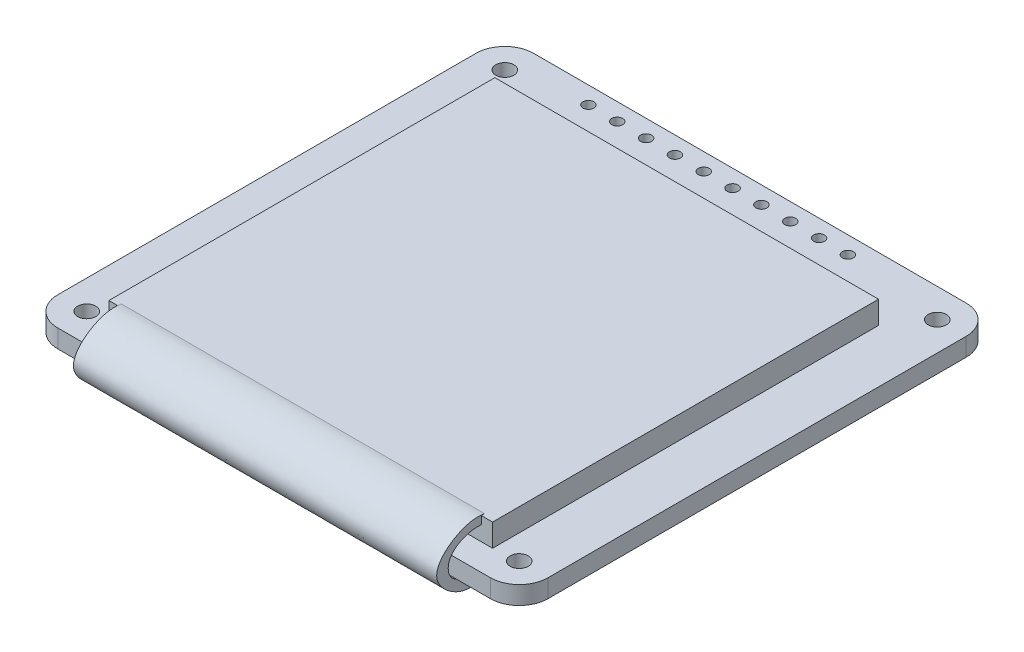
ISO-10303-21;
HEADER;
FILE_DESCRIPTION(('STEP AP214'),'2;1');
FILE_NAME('part.step','',(''),(''),'','','');
FILE_SCHEMA(('AUTOMOTIVE_DESIGN { 1 0 10303 214 1 1 1 1 }'));
ENDSEC;
DATA;
#1=APPLICATION_CONTEXT('core data for automotive mechanical design processes');
#2=APPLICATION_PROTOCOL_DEFINITION('international standard','automotive_design',2000,#1);
#3=PRODUCT_CONTEXT('',#1,'mechanical');
#4=PRODUCT('Part','Part','',(#3));
#5=PRODUCT_RELATED_PRODUCT_CATEGORY('part','',(#4));
#6=PRODUCT_DEFINITION_FORMATION('','',#4);
#7=PRODUCT_DEFINITION_CONTEXT('part definition',#1,'design');
#8=PRODUCT_DEFINITION('design','',#6,#7);
#9=PRODUCT_DEFINITION_SHAPE('','',#8);
#10=(LENGTH_UNIT() NAMED_UNIT(*) SI_UNIT(.MILLI.,.METRE.));
#11=(NAMED_UNIT(*) PLANE_ANGLE_UNIT() SI_UNIT($,.RADIAN.));
#12=(NAMED_UNIT(*) SI_UNIT($,.STERADIAN.) SOLID_ANGLE_UNIT());
#13=UNCERTAINTY_MEASURE_WITH_UNIT(LENGTH_MEASURE(1.E-05),#10,'distance_accuracy_value','');
#14=(GEOMETRIC_REPRESENTATION_CONTEXT(3) GLOBAL_UNCERTAINTY_ASSIGNED_CONTEXT((#13)) GLOBAL_UNIT_ASSIGNED_CONTEXT((#10,
#11,#12)) REPRESENTATION_CONTEXT('',''));
#15=CARTESIAN_POINT('',(0.,0.,0.));
#16=DIRECTION('',(0.,0.,1.));
#17=DIRECTION('',(1.,0.,0.));
#18=AXIS2_PLACEMENT_3D('',#15,#16,#17);
#19=CARTESIAN_POINT('',(0.,0.,0.));
#20=DIRECTION('',(0.,1.,0.));
#21=DIRECTION('',(0.,0.,1.));
#22=AXIS2_PLACEMENT_3D('',#19,#20,#21);
#23=PLANE('',#22);
#24=DIRECTION('',(-1.,0.,0.));
#25=VECTOR('',#24,1.);
#26=CARTESIAN_POINT('',(0.,0.,-41.91));
#27=LINE('',#26,#25);
#28=CARTESIAN_POINT('',(40.64,0.,-41.91));
#29=VERTEX_POINT('',#28);
#30=CARTESIAN_POINT('',(2.54,0.,-41.91));
#31=VERTEX_POINT('',#30);
#32=EDGE_CURVE('E322',#29,#31,#27,.T.);
#33=ORIENTED_EDGE('',*,*,#32,.F.);
#34=CARTESIAN_POINT('',(40.64,0.,-39.37));
#35=DIRECTION('',(0.,1.,0.));
#36=DIRECTION('',(0.,0.,1.));
#37=AXIS2_PLACEMENT_3D('',#34,#35,#36);
#38=CIRCLE('',#37,2.54);
#39=CARTESIAN_POINT('',(43.18,0.,-39.37));
#40=VERTEX_POINT('',#39);
#41=EDGE_CURVE('E224',#40,#29,#38,.T.);
#42=ORIENTED_EDGE('',*,*,#41,.F.);
#43=DIRECTION('',(0.,0.,-1.));
#44=VECTOR('',#43,1.);
#45=CARTESIAN_POINT('',(43.18,0.,0.));
#46=LINE('',#45,#44);
#47=CARTESIAN_POINT('',(43.18,0.,-2.54));
#48=VERTEX_POINT('',#47);
#49=EDGE_CURVE('E335',#48,#40,#46,.T.);
#50=ORIENTED_EDGE('',*,*,#49,.F.);
#51=CARTESIAN_POINT('',(40.64,0.,-2.54));
#52=DIRECTION('',(0.,1.,0.));
#53=DIRECTION('',(0.,0.,1.));
#54=AXIS2_PLACEMENT_3D('',#51,#52,#53);
#55=CIRCLE('',#54,2.54);
#56=CARTESIAN_POINT('',(40.64,0.,0.));
#57=VERTEX_POINT('',#56);
#58=EDGE_CURVE('E333',#57,#48,#55,.T.);
#59=ORIENTED_EDGE('',*,*,#58,.F.);
#60=DIRECTION('',(1.,0.,0.));
#61=VECTOR('',#60,1.);
#62=CARTESIAN_POINT('',(0.,0.,0.));
#63=LINE('',#62,#61);
#64=CARTESIAN_POINT('',(2.54,0.,0.));
#65=VERTEX_POINT('',#64);
#66=EDGE_CURVE('E331',#65,#57,#63,.T.);
#67=ORIENTED_EDGE('',*,*,#66,.F.);
#68=CARTESIAN_POINT('',(2.54,0.,-2.54));
#69=DIRECTION('',(0.,1.,0.));
#70=DIRECTION('',(0.,0.,1.));
#71=AXIS2_PLACEMENT_3D('',#68,#69,#70);
#72=CIRCLE('',#71,2.54);
#73=CARTESIAN_POINT('',(0.,0.,-2.54));
#74=VERTEX_POINT('',#73);
#75=EDGE_CURVE('E329',#74,#65,#72,.T.);
#76=ORIENTED_EDGE('',*,*,#75,.F.);
#77=DIRECTION('',(0.,0.,1.));
#78=VECTOR('',#77,1.);
#79=CARTESIAN_POINT('',(0.,0.,0.));
#80=LINE('',#79,#78);
#81=CARTESIAN_POINT('',(0.,0.,-39.37));
#82=VERTEX_POINT('',#81);
#83=EDGE_CURVE('E327',#82,#74,#80,.T.);
#84=ORIENTED_EDGE('',*,*,#83,.F.);
#85=CARTESIAN_POINT('',(2.54,0.,-39.37));
#86=DIRECTION('',(0.,1.,0.));
#87=DIRECTION('',(0.,0.,1.));
#88=AXIS2_PLACEMENT_3D('',#85,#86,#87);
#89=CIRCLE('',#88,2.54);
#90=EDGE_CURVE('E325',#31,#82,#89,.T.);
#91=ORIENTED_EDGE('',*,*,#90,.F.);
#92=EDGE_LOOP('',(#33,#42,#50,#59,#67,#76,#84,#91));
#93=FACE_BOUND('',#92,.T.);
#94=CARTESIAN_POINT('',(31.75,0.,-40.386));
#95=DIRECTION('',(0.,1.,0.));
#96=DIRECTION('',(0.,0.,1.));
#97=AXIS2_PLACEMENT_3D('',#94,#95,#96);
#98=CIRCLE('',#97,0.4826);
#99=CARTESIAN_POINT('',(31.75,0.,-39.9034));
#100=VERTEX_POINT('',#99);
#101=EDGE_CURVE('E319',#100,#100,#98,.T.);
#102=ORIENTED_EDGE('',*,*,#101,.T.);
#103=EDGE_LOOP('',(#102));
#104=FACE_BOUND('',#103,.T.);
#105=CARTESIAN_POINT('',(29.21,0.,-40.386));
#106=DIRECTION('',(0.,1.,0.));
#107=DIRECTION('',(0.,0.,1.));
#108=AXIS2_PLACEMENT_3D('',#105,#106,#107);
#109=CIRCLE('',#108,0.4826);
#110=CARTESIAN_POINT('',(29.21,0.,-39.9034));
#111=VERTEX_POINT('',#110);
#112=EDGE_CURVE('E316',#111,#111,#109,.T.);
#113=ORIENTED_EDGE('',*,*,#112,.T.);
#114=EDGE_LOOP('',(#113));
#115=FACE_BOUND('',#114,.T.);
#116=CARTESIAN_POINT('',(26.67,0.,-40.386));
#117=DIRECTION('',(0.,1.,0.));
#118=DIRECTION('',(0.,0.,1.));
#119=AXIS2_PLACEMENT_3D('',#116,#117,#118);
#120=CIRCLE('',#119,0.4826);
#121=CARTESIAN_POINT('',(26.67,0.,-39.9034));
#122=VERTEX_POINT('',#121);
#123=EDGE_CURVE('E313',#122,#122,#120,.T.);
#124=ORIENTED_EDGE('',*,*,#123,.T.);
#125=EDGE_LOOP('',(#124));
#126=FACE_BOUND('',#125,.T.);
#127=CARTESIAN_POINT('',(24.13,0.,-40.386));
#128=DIRECTION('',(0.,1.,0.));
#129=DIRECTION('',(0.,0.,1.));
#130=AXIS2_PLACEMENT_3D('',#127,#128,#129);
#131=CIRCLE('',#130,0.4826);
#132=CARTESIAN_POINT('',(24.13,0.,-39.9034));
#133=VERTEX_POINT('',#132);
#134=EDGE_CURVE('E310',#133,#133,#131,.T.);
#135=ORIENTED_EDGE('',*,*,#134,.T.);
#136=EDGE_LOOP('',(#135));
#137=FACE_BOUND('',#136,.T.);
#138=CARTESIAN_POINT('',(21.59,0.,-40.386));
#139=DIRECTION('',(0.,1.,0.));
#140=DIRECTION('',(0.,0.,1.));
#141=AXIS2_PLACEMENT_3D('',#138,#139,#140);
#142=CIRCLE('',#141,0.4826);
#143=CARTESIAN_POINT('',(21.59,0.,-39.9034));
#144=VERTEX_POINT('',#143);
#145=EDGE_CURVE('E307',#144,#144,#142,.T.);
#146=ORIENTED_EDGE('',*,*,#145,.T.);
#147=EDGE_LOOP('',(#146));
#148=FACE_BOUND('',#147,.T.);
#149=CARTESIAN_POINT('',(19.05,0.,-40.386));
#150=DIRECTION('',(0.,1.,0.));
#151=DIRECTION('',(0.,0.,1.));
#152=AXIS2_PLACEMENT_3D('',#149,#150,#151);
#153=CIRCLE('',#152,0.482600000000003);
#154=CARTESIAN_POINT('',(19.05,0.,-39.9034));
#155=VERTEX_POINT('',#154);
#156=EDGE_CURVE('E304',#155,#155,#153,.T.);
#157=ORIENTED_EDGE('',*,*,#156,.T.);
#158=EDGE_LOOP('',(#157));
#159=FACE_BOUND('',#158,.T.);
#160=CARTESIAN_POINT('',(16.51,0.,-40.386));
#161=DIRECTION('',(0.,1.,0.));
#162=DIRECTION('',(0.,0.,1.));
#163=AXIS2_PLACEMENT_3D('',#160,#161,#162);
#164=CIRCLE('',#163,0.482600000000003);
#165=CARTESIAN_POINT('',(16.51,0.,-39.9034));
#166=VERTEX_POINT('',#165);
#167=EDGE_CURVE('E301',#166,#166,#164,.T.);
#168=ORIENTED_EDGE('',*,*,#167,.T.);
#169=EDGE_LOOP('',(#168));
#170=FACE_BOUND('',#169,.T.);
#171=CARTESIAN_POINT('',(13.97,0.,-40.386));
#172=DIRECTION('',(0.,1.,0.));
#173=DIRECTION('',(0.,0.,1.));
#174=AXIS2_PLACEMENT_3D('',#171,#172,#173);
#175=CIRCLE('',#174,0.4826);
#176=CARTESIAN_POINT('',(13.97,0.,-39.9034));
#177=VERTEX_POINT('',#176);
#178=EDGE_CURVE('E298',#177,#177,#175,.T.);
#179=ORIENTED_EDGE('',*,*,#178,.T.);
#180=EDGE_LOOP('',(#179));
#181=FACE_BOUND('',#180,.T.);
#182=CARTESIAN_POINT('',(11.43,0.,-40.386));
#183=DIRECTION('',(0.,1.,0.));
#184=DIRECTION('',(0.,0.,1.));
#185=AXIS2_PLACEMENT_3D('',#182,#183,#184);
#186=CIRCLE('',#185,0.4826);
#187=CARTESIAN_POINT('',(11.43,0.,-39.9034));
#188=VERTEX_POINT('',#187);
#189=EDGE_CURVE('E295',#188,#188,#186,.T.);
#190=ORIENTED_EDGE('',*,*,#189,.T.);
#191=EDGE_LOOP('',(#190));
#192=FACE_BOUND('',#191,.T.);
#193=CARTESIAN_POINT('',(8.89,0.,-40.386));
#194=DIRECTION('',(0.,1.,0.));
#195=DIRECTION('',(0.,0.,1.));
#196=AXIS2_PLACEMENT_3D('',#193,#194,#195);
#197=CIRCLE('',#196,0.4826);
#198=CARTESIAN_POINT('',(8.89,0.,-39.9034));
#199=VERTEX_POINT('',#198);
#200=EDGE_CURVE('E292',#199,#199,#197,.T.);
#201=ORIENTED_EDGE('',*,*,#200,.T.);
#202=EDGE_LOOP('',(#201));
#203=FACE_BOUND('',#202,.T.);
#204=CARTESIAN_POINT('',(2.54,0.,-2.54));
#205=DIRECTION('',(0.,1.,0.));
#206=DIRECTION('',(0.,0.,1.));
#207=AXIS2_PLACEMENT_3D('',#204,#205,#206);
#208=CIRCLE('',#207,0.8);
#209=CARTESIAN_POINT('',(2.54,0.,-1.74));
#210=VERTEX_POINT('',#209);
#211=EDGE_CURVE('E289',#210,#210,#208,.T.);
#212=ORIENTED_EDGE('',*,*,#211,.T.);
#213=EDGE_LOOP('',(#212));
#214=FACE_BOUND('',#213,.T.);
#215=CARTESIAN_POINT('',(40.64,0.,-2.54));
#216=DIRECTION('',(0.,1.,0.));
#217=DIRECTION('',(0.,0.,1.));
#218=AXIS2_PLACEMENT_3D('',#215,#216,#217);
#219=CIRCLE('',#218,0.8);
#220=CARTESIAN_POINT('',(40.64,0.,-1.74));
#221=VERTEX_POINT('',#220);
#222=EDGE_CURVE('E286',#221,#221,#219,.T.);
#223=ORIENTED_EDGE('',*,*,#222,.T.);
#224=EDGE_LOOP('',(#223));
#225=FACE_BOUND('',#224,.T.);
#226=CARTESIAN_POINT('',(40.64,0.,-39.37));
#227=DIRECTION('',(0.,1.,0.));
#228=DIRECTION('',(0.,0.,1.));
#229=AXIS2_PLACEMENT_3D('',#226,#227,#228);
#230=CIRCLE('',#229,0.799999999999995);
#231=CARTESIAN_POINT('',(40.64,0.,-38.57));
#232=VERTEX_POINT('',#231);
#233=EDGE_CURVE('E283',#232,#232,#230,.T.);
#234=ORIENTED_EDGE('',*,*,#233,.T.);
#235=EDGE_LOOP('',(#234));
#236=FACE_BOUND('',#235,.T.);
#237=CARTESIAN_POINT('',(2.54,0.,-39.37));
#238=DIRECTION('',(0.,1.,0.));
#239=DIRECTION('',(0.,0.,1.));
#240=AXIS2_PLACEMENT_3D('',#237,#238,#239);
#241=CIRCLE('',#240,0.799999999999995);
#242=CARTESIAN_POINT('',(2.54,0.,-38.57));
#243=VERTEX_POINT('',#242);
#244=EDGE_CURVE('E219',#243,#243,#241,.T.);
#245=ORIENTED_EDGE('',*,*,#244,.T.);
#246=EDGE_LOOP('',(#245));
#247=FACE_BOUND('',#246,.T.);
#248=DIRECTION('',(-1.,0.,0.));
#249=VECTOR('',#248,1.);
#250=CARTESIAN_POINT('',(37.5,0.,-6.2546976987071));
#251=LINE('',#250,#249);
#252=CARTESIAN_POINT('',(5.5,-3.86409654273834E-13,-6.2546976987068));
#253=VERTEX_POINT('',#252);
#254=CARTESIAN_POINT('',(37.5,-3.86409654273834E-13,-6.2546976987068));
#255=VERTEX_POINT('',#254);
#256=EDGE_CURVE('E164',#253,#255,#251,.F.);
#257=ORIENTED_EDGE('',*,*,#256,.F.);
#258=DIRECTION('',(0.,0.,1.));
#259=VECTOR('',#258,1.);
#260=CARTESIAN_POINT('',(5.5,0.,0.));
#261=LINE('',#260,#259);
#262=CARTESIAN_POINT('',(5.5,0.,-4.65358098531131));
#263=VERTEX_POINT('',#262);
#264=EDGE_CURVE('E185',#253,#263,#261,.T.);
#265=ORIENTED_EDGE('',*,*,#264,.T.);
#266=DIRECTION('',(-1.,0.,0.));
#267=VECTOR('',#266,1.);
#268=CARTESIAN_POINT('',(37.5,0.,-4.65358098531142));
#269=LINE('',#268,#267);
#270=CARTESIAN_POINT('',(37.5,0.,-4.65358098531142));
#271=VERTEX_POINT('',#270);
#272=EDGE_CURVE('E180',#263,#271,#269,.F.);
#273=ORIENTED_EDGE('',*,*,#272,.T.);
#274=DIRECTION('',(0.,0.,1.));
#275=VECTOR('',#274,1.);
#276=CARTESIAN_POINT('',(37.5,0.,0.));
#277=LINE('',#276,#275);
#278=EDGE_CURVE('E175',#255,#271,#277,.T.);
#279=ORIENTED_EDGE('',*,*,#278,.F.);
#280=EDGE_LOOP('',(#257,#265,#273,#279));
#281=FACE_BOUND('',#280,.T.);
#282=ADVANCED_FACE('F46',(#93,#104,#115,#126,#137,#148,#159,#170,#181,#192,#203,#214,#225,#236,
#247,#281),#23,.F.);
#283=CARTESIAN_POINT('',(4.69,3.6,-2.34384451123729));
#284=DIRECTION('',(0.,0.,-1.));
#285=DIRECTION('',(-1.,0.,0.));
#286=AXIS2_PLACEMENT_3D('',#283,#284,#285);
#287=PLANE('',#286);
#288=DIRECTION('',(0.,1.,0.));
#289=VECTOR('',#288,1.);
#290=CARTESIAN_POINT('',(37.5,3.6,-2.34384451123729));
#291=LINE('',#290,#289);
#292=CARTESIAN_POINT('',(37.5,2.90662544501408,-2.34384451123717));
#293=VERTEX_POINT('',#292);
#294=CARTESIAN_POINT('',(37.5,3.6,-2.34384451123729));
#295=VERTEX_POINT('',#294);
#296=EDGE_CURVE('E181',#293,#295,#291,.T.);
#297=ORIENTED_EDGE('',*,*,#296,.F.);
#298=DIRECTION('',(-1.,0.,0.));
#299=VECTOR('',#298,1.);
#300=CARTESIAN_POINT('',(37.5,2.90662544501407,-2.34384451123729));
#301=LINE('',#300,#299);
#302=CARTESIAN_POINT('',(5.5,2.90662544501408,-2.34384451123717));
#303=VERTEX_POINT('',#302);
#304=EDGE_CURVE('E13',#293,#303,#301,.T.);
#305=ORIENTED_EDGE('',*,*,#304,.T.);
#306=DIRECTION('',(0.,1.,0.));
#307=VECTOR('',#306,1.);
#308=CARTESIAN_POINT('',(5.5,3.6,-2.34384451123729));
#309=LINE('',#308,#307);
#310=CARTESIAN_POINT('',(5.5,3.6,-2.34384451123729));
#311=VERTEX_POINT('',#310);
#312=EDGE_CURVE('E171',#303,#311,#309,.T.);
#313=ORIENTED_EDGE('',*,*,#312,.T.);
#314=DIRECTION('',(1.,0.,0.));
#315=VECTOR('',#314,1.);
#316=CARTESIAN_POINT('',(4.69,3.6,-2.34384451123729));
#317=LINE('',#316,#315);
#318=CARTESIAN_POINT('',(4.69,3.6,-2.34384451123729));
#319=VERTEX_POINT('',#318);
#320=EDGE_CURVE('E194',#319,#311,#317,.T.);
#321=ORIENTED_EDGE('',*,*,#320,.F.);
#322=DIRECTION('',(0.,-1.,0.));
#323=VECTOR('',#322,1.);
#324=CARTESIAN_POINT('',(4.69,3.6,-2.34384451123729));
#325=LINE('',#324,#323);
#326=CARTESIAN_POINT('',(4.69,1.6,-2.34384451123729));
#327=VERTEX_POINT('',#326);
#328=EDGE_CURVE('E217',#319,#327,#325,.T.);
#329=ORIENTED_EDGE('',*,*,#328,.T.);
#330=DIRECTION('',(1.,0.,0.));
#331=VECTOR('',#330,1.);
#332=CARTESIAN_POINT('',(4.69,1.6,-2.34384451123729));
#333=LINE('',#332,#331);
#334=CARTESIAN_POINT('',(38.49,1.6,-2.34384451123729));
#335=VERTEX_POINT('',#334);
#336=EDGE_CURVE('E204',#327,#335,#333,.T.);
#337=ORIENTED_EDGE('',*,*,#336,.T.);
#338=DIRECTION('',(0.,-1.,0.));
#339=VECTOR('',#338,1.);
#340=CARTESIAN_POINT('',(38.49,3.6,-2.34384451123729));
#341=LINE('',#340,#339);
#342=CARTESIAN_POINT('',(38.49,3.6,-2.34384451123729));
#343=VERTEX_POINT('',#342);
#344=EDGE_CURVE('E214',#343,#335,#341,.T.);
#345=ORIENTED_EDGE('',*,*,#344,.F.);
#346=EDGE_CURVE('E192',#295,#343,#317,.T.);
#347=ORIENTED_EDGE('',*,*,#346,.F.);
#348=EDGE_LOOP('',(#297,#305,#313,#321,#329,#337,#345,#347));
#349=FACE_BOUND('',#348,.T.);
#350=ADVANCED_FACE('F371',(#349),#287,.F.);
#351=CARTESIAN_POINT('',(0.,3.6,0.));
#352=DIRECTION('',(0.,1.,0.));
#353=DIRECTION('',(0.,0.,1.));
#354=AXIS2_PLACEMENT_3D('',#351,#352,#353);
#355=PLANE('',#354);
#356=DIRECTION('',(-1.,0.,0.));
#357=VECTOR('',#356,1.);
#358=CARTESIAN_POINT('',(37.5,3.6,-2.63646709110652));
#359=LINE('',#358,#357);
#360=CARTESIAN_POINT('',(5.5,3.6,-2.63646709110653));
#361=VERTEX_POINT('',#360);
#362=CARTESIAN_POINT('',(37.5,3.6,-2.63646709110652));
#363=VERTEX_POINT('',#362);
#364=EDGE_CURVE('E361',#361,#363,#359,.F.);
#365=ORIENTED_EDGE('',*,*,#364,.T.);
#366=DIRECTION('',(0.,0.,1.));
#367=VECTOR('',#366,1.);
#368=CARTESIAN_POINT('',(37.5,3.6,0.));
#369=LINE('',#368,#367);
#370=EDGE_CURVE('E54',#363,#295,#369,.T.);
#371=ORIENTED_EDGE('',*,*,#370,.T.);
#372=ORIENTED_EDGE('',*,*,#346,.T.);
#373=DIRECTION('',(0.,0.,-1.));
#374=VECTOR('',#373,1.);
#375=CARTESIAN_POINT('',(38.49,3.6,-36.3438445112373));
#376=LINE('',#375,#374);
#377=CARTESIAN_POINT('',(38.49,3.6,-36.3438445112373));
#378=VERTEX_POINT('',#377);
#379=EDGE_CURVE('E197',#343,#378,#376,.T.);
#380=ORIENTED_EDGE('',*,*,#379,.T.);
#381=DIRECTION('',(-1.,0.,0.));
#382=VECTOR('',#381,1.);
#383=CARTESIAN_POINT('',(4.69,3.6,-36.3438445112373));
#384=LINE('',#383,#382);
#385=CARTESIAN_POINT('',(4.69,3.6,-36.3438445112373));
#386=VERTEX_POINT('',#385);
#387=EDGE_CURVE('E199',#378,#386,#384,.T.);
#388=ORIENTED_EDGE('',*,*,#387,.T.);
#389=DIRECTION('',(0.,0.,1.));
#390=VECTOR('',#389,1.);
#391=CARTESIAN_POINT('',(4.69,3.6,-36.3438445112373));
#392=LINE('',#391,#390);
#393=EDGE_CURVE('E189',#386,#319,#392,.T.);
#394=ORIENTED_EDGE('',*,*,#393,.T.);
#395=ORIENTED_EDGE('',*,*,#320,.T.);
#396=DIRECTION('',(0.,0.,1.));
#397=VECTOR('',#396,1.);
#398=CARTESIAN_POINT('',(5.5,3.6,0.));
#399=LINE('',#398,#397);
#400=EDGE_CURVE('E363',#361,#311,#399,.T.);
#401=ORIENTED_EDGE('',*,*,#400,.F.);
#402=EDGE_LOOP('',(#365,#371,#372,#380,#388,#394,#395,#401));
#403=FACE_BOUND('',#402,.T.);
#404=ADVANCED_FACE('F366',(#403),#355,.T.);
#405=CARTESIAN_POINT('',(0.,1.6,0.));
#406=DIRECTION('',(0.,1.,0.));
#407=DIRECTION('',(0.,0.,1.));
#408=AXIS2_PLACEMENT_3D('',#405,#406,#407);
#409=PLANE('',#408);
#410=CARTESIAN_POINT('',(2.54,1.6,-39.37));
#411=DIRECTION('',(0.,1.,0.));
#412=DIRECTION('',(0.,0.,1.));
#413=AXIS2_PLACEMENT_3D('',#410,#411,#412);
#414=CIRCLE('',#413,0.799999999999995);
#415=CARTESIAN_POINT('',(2.54,1.6,-38.57));
#416=VERTEX_POINT('',#415);
#417=EDGE_CURVE('E220',#416,#416,#414,.T.);
#418=ORIENTED_EDGE('',*,*,#417,.F.);
#419=EDGE_LOOP('',(#418));
#420=FACE_BOUND('',#419,.T.);
#421=CARTESIAN_POINT('',(40.64,1.6,-39.37));
#422=DIRECTION('',(0.,1.,0.));
#423=DIRECTION('',(0.,0.,1.));
#424=AXIS2_PLACEMENT_3D('',#421,#422,#423);
#425=CIRCLE('',#424,0.799999999999995);
#426=CARTESIAN_POINT('',(40.64,1.6,-38.57));
#427=VERTEX_POINT('',#426);
#428=EDGE_CURVE('E223',#427,#427,#425,.T.);
#429=ORIENTED_EDGE('',*,*,#428,.F.);
#430=EDGE_LOOP('',(#429));
#431=FACE_BOUND('',#430,.T.);
#432=CARTESIAN_POINT('',(40.64,1.6,-2.54));
#433=DIRECTION('',(0.,1.,0.));
#434=DIRECTION('',(0.,0.,1.));
#435=AXIS2_PLACEMENT_3D('',#432,#433,#434);
#436=CIRCLE('',#435,0.8);
#437=CARTESIAN_POINT('',(40.64,1.6,-1.74));
#438=VERTEX_POINT('',#437);
#439=EDGE_CURVE('E227',#438,#438,#436,.T.);
#440=ORIENTED_EDGE('',*,*,#439,.F.);
#441=EDGE_LOOP('',(#440));
#442=FACE_BOUND('',#441,.T.);
#443=CARTESIAN_POINT('',(2.54,1.6,-2.54));
#444=DIRECTION('',(0.,1.,0.));
#445=DIRECTION('',(0.,0.,1.));
#446=AXIS2_PLACEMENT_3D('',#443,#444,#445);
#447=CIRCLE('',#446,0.8);
#448=CARTESIAN_POINT('',(2.54,1.6,-1.74));
#449=VERTEX_POINT('',#448);
#450=EDGE_CURVE('E230',#449,#449,#447,.T.);
#451=ORIENTED_EDGE('',*,*,#450,.F.);
#452=EDGE_LOOP('',(#451));
#453=FACE_BOUND('',#452,.T.);
#454=CARTESIAN_POINT('',(8.89,1.6,-40.386));
#455=DIRECTION('',(0.,1.,0.));
#456=DIRECTION('',(0.,0.,1.));
#457=AXIS2_PLACEMENT_3D('',#454,#455,#456);
#458=CIRCLE('',#457,0.4826);
#459=CARTESIAN_POINT('',(8.89,1.6,-39.9034));
#460=VERTEX_POINT('',#459);
#461=EDGE_CURVE('E233',#460,#460,#458,.T.);
#462=ORIENTED_EDGE('',*,*,#461,.F.);
#463=EDGE_LOOP('',(#462));
#464=FACE_BOUND('',#463,.T.);
#465=CARTESIAN_POINT('',(11.43,1.6,-40.386));
#466=DIRECTION('',(0.,1.,0.));
#467=DIRECTION('',(0.,0.,1.));
#468=AXIS2_PLACEMENT_3D('',#465,#466,#467);
#469=CIRCLE('',#468,0.4826);
#470=CARTESIAN_POINT('',(11.43,1.6,-39.9034));
#471=VERTEX_POINT('',#470);
#472=EDGE_CURVE('E236',#471,#471,#469,.T.);
#473=ORIENTED_EDGE('',*,*,#472,.F.);
#474=EDGE_LOOP('',(#473));
#475=FACE_BOUND('',#474,.T.);
#476=CARTESIAN_POINT('',(13.97,1.6,-40.386));
#477=DIRECTION('',(0.,1.,0.));
#478=DIRECTION('',(0.,0.,1.));
#479=AXIS2_PLACEMENT_3D('',#476,#477,#478);
#480=CIRCLE('',#479,0.4826);
#481=CARTESIAN_POINT('',(13.97,1.6,-39.9034));
#482=VERTEX_POINT('',#481);
#483=EDGE_CURVE('E239',#482,#482,#480,.T.);
#484=ORIENTED_EDGE('',*,*,#483,.F.);
#485=EDGE_LOOP('',(#484));
#486=FACE_BOUND('',#485,.T.);
#487=CARTESIAN_POINT('',(16.51,1.6,-40.386));
#488=DIRECTION('',(0.,1.,0.));
#489=DIRECTION('',(0.,0.,1.));
#490=AXIS2_PLACEMENT_3D('',#487,#488,#489);
#491=CIRCLE('',#490,0.482600000000003);
#492=CARTESIAN_POINT('',(16.51,1.6,-39.9034));
#493=VERTEX_POINT('',#492);
#494=EDGE_CURVE('E242',#493,#493,#491,.T.);
#495=ORIENTED_EDGE('',*,*,#494,.F.);
#496=EDGE_LOOP('',(#495));
#497=FACE_BOUND('',#496,.T.);
#498=CARTESIAN_POINT('',(19.05,1.6,-40.386));
#499=DIRECTION('',(0.,1.,0.));
#500=DIRECTION('',(0.,0.,1.));
#501=AXIS2_PLACEMENT_3D('',#498,#499,#500);
#502=CIRCLE('',#501,0.482600000000003);
#503=CARTESIAN_POINT('',(19.05,1.6,-39.9034));
#504=VERTEX_POINT('',#503);
#505=EDGE_CURVE('E245',#504,#504,#502,.T.);
#506=ORIENTED_EDGE('',*,*,#505,.F.);
#507=EDGE_LOOP('',(#506));
#508=FACE_BOUND('',#507,.T.);
#509=CARTESIAN_POINT('',(21.59,1.6,-40.386));
#510=DIRECTION('',(0.,1.,0.));
#511=DIRECTION('',(0.,0.,1.));
#512=AXIS2_PLACEMENT_3D('',#509,#510,#511);
#513=CIRCLE('',#512,0.4826);
#514=CARTESIAN_POINT('',(21.59,1.6,-39.9034));
#515=VERTEX_POINT('',#514);
#516=EDGE_CURVE('E248',#515,#515,#513,.T.);
#517=ORIENTED_EDGE('',*,*,#516,.F.);
#518=EDGE_LOOP('',(#517));
#519=FACE_BOUND('',#518,.T.);
#520=CARTESIAN_POINT('',(24.13,1.6,-40.386));
#521=DIRECTION('',(0.,1.,0.));
#522=DIRECTION('',(0.,0.,1.));
#523=AXIS2_PLACEMENT_3D('',#520,#521,#522);
#524=CIRCLE('',#523,0.4826);
#525=CARTESIAN_POINT('',(24.13,1.6,-39.9034));
#526=VERTEX_POINT('',#525);
#527=EDGE_CURVE('E251',#526,#526,#524,.T.);
#528=ORIENTED_EDGE('',*,*,#527,.F.);
#529=EDGE_LOOP('',(#528));
#530=FACE_BOUND('',#529,.T.);
#531=CARTESIAN_POINT('',(26.67,1.6,-40.386));
#532=DIRECTION('',(0.,1.,0.));
#533=DIRECTION('',(0.,0.,1.));
#534=AXIS2_PLACEMENT_3D('',#531,#532,#533);
#535=CIRCLE('',#534,0.4826);
#536=CARTESIAN_POINT('',(26.67,1.6,-39.9034));
#537=VERTEX_POINT('',#536);
#538=EDGE_CURVE('E254',#537,#537,#535,.T.);
#539=ORIENTED_EDGE('',*,*,#538,.F.);
#540=EDGE_LOOP('',(#539));
#541=FACE_BOUND('',#540,.T.);
#542=CARTESIAN_POINT('',(29.21,1.6,-40.386));
#543=DIRECTION('',(0.,1.,0.));
#544=DIRECTION('',(0.,0.,1.));
#545=AXIS2_PLACEMENT_3D('',#542,#543,#544);
#546=CIRCLE('',#545,0.4826);
#547=CARTESIAN_POINT('',(29.21,1.6,-39.9034));
#548=VERTEX_POINT('',#547);
#549=EDGE_CURVE('E257',#548,#548,#546,.T.);
#550=ORIENTED_EDGE('',*,*,#549,.F.);
#551=EDGE_LOOP('',(#550));
#552=FACE_BOUND('',#551,.T.);
#553=CARTESIAN_POINT('',(31.75,1.6,-40.386));
#554=DIRECTION('',(0.,1.,0.));
#555=DIRECTION('',(0.,0.,1.));
#556=AXIS2_PLACEMENT_3D('',#553,#554,#555);
#557=CIRCLE('',#556,0.4826);
#558=CARTESIAN_POINT('',(31.75,1.6,-39.9034));
#559=VERTEX_POINT('',#558);
#560=EDGE_CURVE('E260',#559,#559,#557,.T.);
#561=ORIENTED_EDGE('',*,*,#560,.F.);
#562=EDGE_LOOP('',(#561));
#563=FACE_BOUND('',#562,.T.);
#564=DIRECTION('',(-1.,0.,0.));
#565=VECTOR('',#564,1.);
#566=CARTESIAN_POINT('',(0.,1.6,-41.91));
#567=LINE('',#566,#565);
#568=CARTESIAN_POINT('',(40.64,1.6,-41.91));
#569=VERTEX_POINT('',#568);
#570=CARTESIAN_POINT('',(2.54,1.6,-41.91));
#571=VERTEX_POINT('',#570);
#572=EDGE_CURVE('E263',#569,#571,#567,.T.);
#573=ORIENTED_EDGE('',*,*,#572,.T.);
#574=CARTESIAN_POINT('',(2.54,1.6,-39.37));
#575=DIRECTION('',(0.,1.,0.));
#576=DIRECTION('',(0.,0.,1.));
#577=AXIS2_PLACEMENT_3D('',#574,#575,#576);
#578=CIRCLE('',#577,2.54);
#579=CARTESIAN_POINT('',(0.,1.6,-39.37));
#580=VERTEX_POINT('',#579);
#581=EDGE_CURVE('E266',#571,#580,#578,.T.);
#582=ORIENTED_EDGE('',*,*,#581,.T.);
#583=DIRECTION('',(0.,0.,1.));
#584=VECTOR('',#583,1.);
#585=CARTESIAN_POINT('',(0.,1.6,0.));
#586=LINE('',#585,#584);
#587=CARTESIAN_POINT('',(0.,1.6,-2.54));
#588=VERTEX_POINT('',#587);
#589=EDGE_CURVE('E268',#580,#588,#586,.T.);
#590=ORIENTED_EDGE('',*,*,#589,.T.);
#591=CARTESIAN_POINT('',(2.54,1.6,-2.54));
#592=DIRECTION('',(0.,1.,0.));
#593=DIRECTION('',(0.,0.,1.));
#594=AXIS2_PLACEMENT_3D('',#591,#592,#593);
#595=CIRCLE('',#594,2.54);
#596=CARTESIAN_POINT('',(2.54,1.6,0.));
#597=VERTEX_POINT('',#596);
#598=EDGE_CURVE('E270',#588,#597,#595,.T.);
#599=ORIENTED_EDGE('',*,*,#598,.T.);
#600=DIRECTION('',(1.,0.,0.));
#601=VECTOR('',#600,1.);
#602=CARTESIAN_POINT('',(0.,1.6,0.));
#603=LINE('',#602,#601);
#604=CARTESIAN_POINT('',(40.64,1.6,0.));
#605=VERTEX_POINT('',#604);
#606=EDGE_CURVE('E272',#597,#605,#603,.T.);
#607=ORIENTED_EDGE('',*,*,#606,.T.);
#608=CARTESIAN_POINT('',(40.64,1.6,-2.54));
#609=DIRECTION('',(0.,1.,0.));
#610=DIRECTION('',(0.,0.,1.));
#611=AXIS2_PLACEMENT_3D('',#608,#609,#610);
#612=CIRCLE('',#611,2.54);
#613=CARTESIAN_POINT('',(43.18,1.6,-2.54));
#614=VERTEX_POINT('',#613);
#615=EDGE_CURVE('E274',#605,#614,#612,.T.);
#616=ORIENTED_EDGE('',*,*,#615,.T.);
#617=DIRECTION('',(0.,0.,-1.));
#618=VECTOR('',#617,1.);
#619=CARTESIAN_POINT('',(43.18,1.6,0.));
#620=LINE('',#619,#618);
#621=CARTESIAN_POINT('',(43.18,1.6,-39.37));
#622=VERTEX_POINT('',#621);
#623=EDGE_CURVE('E276',#614,#622,#620,.T.);
#624=ORIENTED_EDGE('',*,*,#623,.T.);
#625=CARTESIAN_POINT('',(40.64,1.6,-39.37));
#626=DIRECTION('',(0.,1.,0.));
#627=DIRECTION('',(0.,0.,1.));
#628=AXIS2_PLACEMENT_3D('',#625,#626,#627);
#629=CIRCLE('',#628,2.54);
#630=EDGE_CURVE('E278',#622,#569,#629,.T.);
#631=ORIENTED_EDGE('',*,*,#630,.T.);
#632=EDGE_LOOP('',(#573,#582,#590,#599,#607,#616,#624,#631));
#633=FACE_BOUND('',#632,.T.);
#634=ORIENTED_EDGE('',*,*,#336,.F.);
#635=DIRECTION('',(0.,0.,1.));
#636=VECTOR('',#635,1.);
#637=CARTESIAN_POINT('',(4.69,1.6,-36.3438445112373));
#638=LINE('',#637,#636);
#639=CARTESIAN_POINT('',(4.69,1.6,-36.3438445112373));
#640=VERTEX_POINT('',#639);
#641=EDGE_CURVE('E183',#640,#327,#638,.T.);
#642=ORIENTED_EDGE('',*,*,#641,.F.);
#643=DIRECTION('',(-1.,0.,0.));
#644=VECTOR('',#643,1.);
#645=CARTESIAN_POINT('',(4.69,1.6,-36.3438445112373));
#646=LINE('',#645,#644);
#647=CARTESIAN_POINT('',(38.49,1.6,-36.3438445112373));
#648=VERTEX_POINT('',#647);
#649=EDGE_CURVE('E193',#648,#640,#646,.T.);
#650=ORIENTED_EDGE('',*,*,#649,.F.);
#651=DIRECTION('',(0.,0.,-1.));
#652=VECTOR('',#651,1.);
#653=CARTESIAN_POINT('',(38.49,1.6,-36.3438445112373));
#654=LINE('',#653,#652);
#655=EDGE_CURVE('E206',#335,#648,#654,.T.);
#656=ORIENTED_EDGE('',*,*,#655,.F.);
#657=EDGE_LOOP('',(#634,#642,#650,#656));
#658=FACE_BOUND('',#657,.T.);
#659=ADVANCED_FACE('F418',(#420,#431,#442,#453,#464,#475,#486,#497,#508,#519,#530,#541,#552,
#563,#633,#658),#409,.T.);
#660=CARTESIAN_POINT('',(0.,1.6,-41.91));
#661=DIRECTION('',(0.,0.,1.));
#662=DIRECTION('',(1.,0.,0.));
#663=AXIS2_PLACEMENT_3D('',#660,#661,#662);
#664=PLANE('',#663);
#665=ORIENTED_EDGE('',*,*,#32,.T.);
#666=DIRECTION('',(0.,-1.,0.));
#667=VECTOR('',#666,1.);
#668=CARTESIAN_POINT('',(2.54,1.6,-41.91));
#669=LINE('',#668,#667);
#670=EDGE_CURVE('E358',#571,#31,#669,.T.);
#671=ORIENTED_EDGE('',*,*,#670,.F.);
#672=ORIENTED_EDGE('',*,*,#572,.F.);
#673=DIRECTION('',(0.,-1.,0.));
#674=VECTOR('',#673,1.);
#675=CARTESIAN_POINT('',(40.64,1.6,-41.91));
#676=LINE('',#675,#674);
#677=EDGE_CURVE('E280',#569,#29,#676,.T.);
#678=ORIENTED_EDGE('',*,*,#677,.T.);
#679=EDGE_LOOP('',(#665,#671,#672,#678));
#680=FACE_BOUND('',#679,.T.);
#681=ADVANCED_FACE('F431',(#680),#664,.F.);
#682=CARTESIAN_POINT('',(2.54,1.6,-39.37));
#683=DIRECTION('',(0.,-1.,0.));
#684=DIRECTION('',(0.,0.,-1.));
#685=AXIS2_PLACEMENT_3D('',#682,#683,#684);
#686=CYLINDRICAL_SURFACE('',#685,2.54);
#687=ORIENTED_EDGE('',*,*,#90,.T.);
#688=DIRECTION('',(0.,-1.,0.));
#689=VECTOR('',#688,1.);
#690=CARTESIAN_POINT('',(0.,1.6,-39.37));
#691=LINE('',#690,#689);
#692=EDGE_CURVE('E355',#580,#82,#691,.T.);
#693=ORIENTED_EDGE('',*,*,#692,.F.);
#694=ORIENTED_EDGE('',*,*,#581,.F.);
#695=ORIENTED_EDGE('',*,*,#670,.T.);
#696=EDGE_LOOP('',(#687,#693,#694,#695));
#697=FACE_BOUND('',#696,.T.);
#698=ADVANCED_FACE('F459',(#697),#686,.T.);
#699=CARTESIAN_POINT('',(0.,1.6,0.));
#700=DIRECTION('',(1.,0.,0.));
#701=DIRECTION('',(0.,0.,-1.));
#702=AXIS2_PLACEMENT_3D('',#699,#700,#701);
#703=PLANE('',#702);
#704=ORIENTED_EDGE('',*,*,#83,.T.);
#705=DIRECTION('',(0.,-1.,0.));
#706=VECTOR('',#705,1.);
#707=CARTESIAN_POINT('',(0.,1.6,-2.54));
#708=LINE('',#707,#706);
#709=EDGE_CURVE('E352',#588,#74,#708,.T.);
#710=ORIENTED_EDGE('',*,*,#709,.F.);
#711=ORIENTED_EDGE('',*,*,#589,.F.);
#712=ORIENTED_EDGE('',*,*,#692,.T.);
#713=EDGE_LOOP('',(#704,#710,#711,#712));
#714=FACE_BOUND('',#713,.T.);
#715=ADVANCED_FACE('F455',(#714),#703,.F.);
#716=CARTESIAN_POINT('',(2.54,1.6,-2.54));
#717=DIRECTION('',(0.,-1.,0.));
#718=DIRECTION('',(0.,0.,-1.));
#719=AXIS2_PLACEMENT_3D('',#716,#717,#718);
#720=CYLINDRICAL_SURFACE('',#719,2.54);
#721=ORIENTED_EDGE('',*,*,#75,.T.);
#722=DIRECTION('',(0.,-1.,0.));
#723=VECTOR('',#722,1.);
#724=CARTESIAN_POINT('',(2.54,1.6,0.));
#725=LINE('',#724,#723);
#726=EDGE_CURVE('E349',#597,#65,#725,.T.);
#727=ORIENTED_EDGE('',*,*,#726,.F.);
#728=ORIENTED_EDGE('',*,*,#598,.F.);
#729=ORIENTED_EDGE('',*,*,#709,.T.);
#730=EDGE_LOOP('',(#721,#727,#728,#729));
#731=FACE_BOUND('',#730,.T.);
#732=ADVANCED_FACE('F451',(#731),#720,.T.);
#733=CARTESIAN_POINT('',(0.,1.6,0.));
#734=DIRECTION('',(0.,0.,-1.));
#735=DIRECTION('',(-1.,0.,0.));
#736=AXIS2_PLACEMENT_3D('',#733,#734,#735);
#737=PLANE('',#736);
#738=ORIENTED_EDGE('',*,*,#66,.T.);
#739=DIRECTION('',(0.,-1.,0.));
#740=VECTOR('',#739,1.);
#741=CARTESIAN_POINT('',(40.64,1.6,0.));
#742=LINE('',#741,#740);
#743=EDGE_CURVE('E346',#605,#57,#742,.T.);
#744=ORIENTED_EDGE('',*,*,#743,.F.);
#745=ORIENTED_EDGE('',*,*,#606,.F.);
#746=ORIENTED_EDGE('',*,*,#726,.T.);
#747=EDGE_LOOP('',(#738,#744,#745,#746));
#748=FACE_BOUND('',#747,.T.);
#749=ADVANCED_FACE('F447',(#748),#737,.F.);
#750=CARTESIAN_POINT('',(40.64,1.6,-2.54));
#751=DIRECTION('',(0.,-1.,0.));
#752=DIRECTION('',(0.,0.,-1.));
#753=AXIS2_PLACEMENT_3D('',#750,#751,#752);
#754=CYLINDRICAL_SURFACE('',#753,2.54);
#755=ORIENTED_EDGE('',*,*,#58,.T.);
#756=DIRECTION('',(0.,-1.,0.));
#757=VECTOR('',#756,1.);
#758=CARTESIAN_POINT('',(43.18,1.6,-2.54));
#759=LINE('',#758,#757);
#760=EDGE_CURVE('E343',#614,#48,#759,.T.);
#761=ORIENTED_EDGE('',*,*,#760,.F.);
#762=ORIENTED_EDGE('',*,*,#615,.F.);
#763=ORIENTED_EDGE('',*,*,#743,.T.);
#764=EDGE_LOOP('',(#755,#761,#762,#763));
#765=FACE_BOUND('',#764,.T.);
#766=ADVANCED_FACE('F443',(#765),#754,.T.);
#767=CARTESIAN_POINT('',(43.18,1.6,0.));
#768=DIRECTION('',(-1.,0.,0.));
#769=DIRECTION('',(0.,0.,1.));
#770=AXIS2_PLACEMENT_3D('',#767,#768,#769);
#771=PLANE('',#770);
#772=ORIENTED_EDGE('',*,*,#49,.T.);
#773=DIRECTION('',(0.,-1.,0.));
#774=VECTOR('',#773,1.);
#775=CARTESIAN_POINT('',(43.18,1.6,-39.37));
#776=LINE('',#775,#774);
#777=EDGE_CURVE('E340',#622,#40,#776,.T.);
#778=ORIENTED_EDGE('',*,*,#777,.F.);
#779=ORIENTED_EDGE('',*,*,#623,.F.);
#780=ORIENTED_EDGE('',*,*,#760,.T.);
#781=EDGE_LOOP('',(#772,#778,#779,#780));
#782=FACE_BOUND('',#781,.T.);
#783=ADVANCED_FACE('F439',(#782),#771,.F.);
#784=CARTESIAN_POINT('',(31.75,1.6,-40.386));
#785=DIRECTION('',(0.,-1.,0.));
#786=DIRECTION('',(0.,0.,-1.));
#787=AXIS2_PLACEMENT_3D('',#784,#785,#786);
#788=CYLINDRICAL_SURFACE('',#787,0.4826);
#789=ORIENTED_EDGE('',*,*,#560,.T.);
#790=EDGE_LOOP('',(#789));
#791=FACE_BOUND('',#790,.T.);
#792=ORIENTED_EDGE('',*,*,#101,.F.);
#793=EDGE_LOOP('',(#792));
#794=FACE_BOUND('',#793,.T.);
#795=ADVANCED_FACE('F442',(#791,#794),#788,.F.);
#796=CARTESIAN_POINT('',(29.21,1.6,-40.386));
#797=DIRECTION('',(0.,-1.,0.));
#798=DIRECTION('',(0.,0.,-1.));
#799=AXIS2_PLACEMENT_3D('',#796,#797,#798);
#800=CYLINDRICAL_SURFACE('',#799,0.4826);
#801=ORIENTED_EDGE('',*,*,#549,.T.);
#802=EDGE_LOOP('',(#801));
#803=FACE_BOUND('',#802,.T.);
#804=ORIENTED_EDGE('',*,*,#112,.F.);
#805=EDGE_LOOP('',(#804));
#806=FACE_BOUND('',#805,.T.);
#807=ADVANCED_FACE('F469',(#803,#806),#800,.F.);
#808=CARTESIAN_POINT('',(26.67,1.6,-40.386));
#809=DIRECTION('',(0.,-1.,0.));
#810=DIRECTION('',(0.,0.,-1.));
#811=AXIS2_PLACEMENT_3D('',#808,#809,#810);
#812=CYLINDRICAL_SURFACE('',#811,0.4826);
#813=ORIENTED_EDGE('',*,*,#538,.T.);
#814=EDGE_LOOP('',(#813));
#815=FACE_BOUND('',#814,.T.);
#816=ORIENTED_EDGE('',*,*,#123,.F.);
#817=EDGE_LOOP('',(#816));
#818=FACE_BOUND('',#817,.T.);
#819=ADVANCED_FACE('F473',(#815,#818),#812,.F.);
#820=CARTESIAN_POINT('',(24.13,1.6,-40.386));
#821=DIRECTION('',(0.,-1.,0.));
#822=DIRECTION('',(0.,0.,-1.));
#823=AXIS2_PLACEMENT_3D('',#820,#821,#822);
#824=CYLINDRICAL_SURFACE('',#823,0.4826);
#825=ORIENTED_EDGE('',*,*,#527,.T.);
#826=EDGE_LOOP('',(#825));
#827=FACE_BOUND('',#826,.T.);
#828=ORIENTED_EDGE('',*,*,#134,.F.);
#829=EDGE_LOOP('',(#828));
#830=FACE_BOUND('',#829,.T.);
#831=ADVANCED_FACE('F477',(#827,#830),#824,.F.);
#832=CARTESIAN_POINT('',(21.59,1.6,-40.386));
#833=DIRECTION('',(0.,-1.,0.));
#834=DIRECTION('',(0.,0.,-1.));
#835=AXIS2_PLACEMENT_3D('',#832,#833,#834);
#836=CYLINDRICAL_SURFACE('',#835,0.4826);
#837=ORIENTED_EDGE('',*,*,#516,.T.);
#838=EDGE_LOOP('',(#837));
#839=FACE_BOUND('',#838,.T.);
#840=ORIENTED_EDGE('',*,*,#145,.F.);
#841=EDGE_LOOP('',(#840));
#842=FACE_BOUND('',#841,.T.);
#843=ADVANCED_FACE('F481',(#839,#842),#836,.F.);
#844=CARTESIAN_POINT('',(19.05,1.6,-40.386));
#845=DIRECTION('',(0.,-1.,0.));
#846=DIRECTION('',(0.,0.,-1.));
#847=AXIS2_PLACEMENT_3D('',#844,#845,#846);
#848=CYLINDRICAL_SURFACE('',#847,0.482600000000003);
#849=ORIENTED_EDGE('',*,*,#505,.T.);
#850=EDGE_LOOP('',(#849));
#851=FACE_BOUND('',#850,.T.);
#852=ORIENTED_EDGE('',*,*,#156,.F.);
#853=EDGE_LOOP('',(#852));
#854=FACE_BOUND('',#853,.T.);
#855=ADVANCED_FACE('F485',(#851,#854),#848,.F.);
#856=CARTESIAN_POINT('',(16.51,1.6,-40.386));
#857=DIRECTION('',(0.,-1.,0.));
#858=DIRECTION('',(0.,0.,-1.));
#859=AXIS2_PLACEMENT_3D('',#856,#857,#858);
#860=CYLINDRICAL_SURFACE('',#859,0.482600000000003);
#861=ORIENTED_EDGE('',*,*,#494,.T.);
#862=EDGE_LOOP('',(#861));
#863=FACE_BOUND('',#862,.T.);
#864=ORIENTED_EDGE('',*,*,#167,.F.);
#865=EDGE_LOOP('',(#864));
#866=FACE_BOUND('',#865,.T.);
#867=ADVANCED_FACE('F489',(#863,#866),#860,.F.);
#868=CARTESIAN_POINT('',(13.97,1.6,-40.386));
#869=DIRECTION('',(0.,-1.,0.));
#870=DIRECTION('',(0.,0.,-1.));
#871=AXIS2_PLACEMENT_3D('',#868,#869,#870);
#872=CYLINDRICAL_SURFACE('',#871,0.4826);
#873=ORIENTED_EDGE('',*,*,#483,.T.);
#874=EDGE_LOOP('',(#873));
#875=FACE_BOUND('',#874,.T.);
#876=ORIENTED_EDGE('',*,*,#178,.F.);
#877=EDGE_LOOP('',(#876));
#878=FACE_BOUND('',#877,.T.);
#879=ADVANCED_FACE('F493',(#875,#878),#872,.F.);
#880=CARTESIAN_POINT('',(11.43,1.6,-40.386));
#881=DIRECTION('',(0.,-1.,0.));
#882=DIRECTION('',(0.,0.,-1.));
#883=AXIS2_PLACEMENT_3D('',#880,#881,#882);
#884=CYLINDRICAL_SURFACE('',#883,0.4826);
#885=ORIENTED_EDGE('',*,*,#472,.T.);
#886=EDGE_LOOP('',(#885));
#887=FACE_BOUND('',#886,.T.);
#888=ORIENTED_EDGE('',*,*,#189,.F.);
#889=EDGE_LOOP('',(#888));
#890=FACE_BOUND('',#889,.T.);
#891=ADVANCED_FACE('F497',(#887,#890),#884,.F.);
#892=CARTESIAN_POINT('',(8.89,1.6,-40.386));
#893=DIRECTION('',(0.,-1.,0.));
#894=DIRECTION('',(0.,0.,-1.));
#895=AXIS2_PLACEMENT_3D('',#892,#893,#894);
#896=CYLINDRICAL_SURFACE('',#895,0.4826);
#897=ORIENTED_EDGE('',*,*,#461,.T.);
#898=EDGE_LOOP('',(#897));
#899=FACE_BOUND('',#898,.T.);
#900=ORIENTED_EDGE('',*,*,#200,.F.);
#901=EDGE_LOOP('',(#900));
#902=FACE_BOUND('',#901,.T.);
#903=ADVANCED_FACE('F501',(#899,#902),#896,.F.);
#904=CARTESIAN_POINT('',(2.54,1.6,-2.54));
#905=DIRECTION('',(0.,-1.,0.));
#906=DIRECTION('',(0.,0.,-1.));
#907=AXIS2_PLACEMENT_3D('',#904,#905,#906);
#908=CYLINDRICAL_SURFACE('',#907,0.8);
#909=ORIENTED_EDGE('',*,*,#450,.T.);
#910=EDGE_LOOP('',(#909));
#911=FACE_BOUND('',#910,.T.);
#912=ORIENTED_EDGE('',*,*,#211,.F.);
#913=EDGE_LOOP('',(#912));
#914=FACE_BOUND('',#913,.T.);
#915=ADVANCED_FACE('F505',(#911,#914),#908,.F.);
#916=CARTESIAN_POINT('',(40.64,1.6,-2.54));
#917=DIRECTION('',(0.,-1.,0.));
#918=DIRECTION('',(0.,0.,-1.));
#919=AXIS2_PLACEMENT_3D('',#916,#917,#918);
#920=CYLINDRICAL_SURFACE('',#919,0.8);
#921=ORIENTED_EDGE('',*,*,#439,.T.);
#922=EDGE_LOOP('',(#921));
#923=FACE_BOUND('',#922,.T.);
#924=ORIENTED_EDGE('',*,*,#222,.F.);
#925=EDGE_LOOP('',(#924));
#926=FACE_BOUND('',#925,.T.);
#927=ADVANCED_FACE('F509',(#923,#926),#920,.F.);
#928=CARTESIAN_POINT('',(40.64,1.6,-39.37));
#929=DIRECTION('',(0.,-1.,0.));
#930=DIRECTION('',(0.,0.,-1.));
#931=AXIS2_PLACEMENT_3D('',#928,#929,#930);
#932=CYLINDRICAL_SURFACE('',#931,0.799999999999995);
#933=ORIENTED_EDGE('',*,*,#428,.T.);
#934=EDGE_LOOP('',(#933));
#935=FACE_BOUND('',#934,.T.);
#936=ORIENTED_EDGE('',*,*,#233,.F.);
#937=EDGE_LOOP('',(#936));
#938=FACE_BOUND('',#937,.T.);
#939=ADVANCED_FACE('F512',(#935,#938),#932,.F.);
#940=CARTESIAN_POINT('',(2.54,1.6,-39.37));
#941=DIRECTION('',(0.,-1.,0.));
#942=DIRECTION('',(0.,0.,-1.));
#943=AXIS2_PLACEMENT_3D('',#940,#941,#942);
#944=CYLINDRICAL_SURFACE('',#943,0.799999999999995);
#945=ORIENTED_EDGE('',*,*,#417,.T.);
#946=EDGE_LOOP('',(#945));
#947=FACE_BOUND('',#946,.T.);
#948=ORIENTED_EDGE('',*,*,#244,.F.);
#949=EDGE_LOOP('',(#948));
#950=FACE_BOUND('',#949,.T.);
#951=ADVANCED_FACE('F48',(#947,#950),#944,.F.);
#952=CARTESIAN_POINT('',(40.64,1.6,-39.37));
#953=DIRECTION('',(0.,-1.,0.));
#954=DIRECTION('',(0.,0.,-1.));
#955=AXIS2_PLACEMENT_3D('',#952,#953,#954);
#956=CYLINDRICAL_SURFACE('',#955,2.54);
#957=ORIENTED_EDGE('',*,*,#41,.T.);
#958=ORIENTED_EDGE('',*,*,#677,.F.);
#959=ORIENTED_EDGE('',*,*,#630,.F.);
#960=ORIENTED_EDGE('',*,*,#777,.T.);
#961=EDGE_LOOP('',(#957,#958,#959,#960));
#962=FACE_BOUND('',#961,.T.);
#963=ADVANCED_FACE('F428',(#962),#956,.T.);
#964=CARTESIAN_POINT('',(4.69,3.6,-36.3438445112373));
#965=DIRECTION('',(1.,0.,0.));
#966=DIRECTION('',(0.,0.,-1.));
#967=AXIS2_PLACEMENT_3D('',#964,#965,#966);
#968=PLANE('',#967);
#969=ORIENTED_EDGE('',*,*,#641,.T.);
#970=ORIENTED_EDGE('',*,*,#328,.F.);
#971=ORIENTED_EDGE('',*,*,#393,.F.);
#972=DIRECTION('',(0.,-1.,0.));
#973=VECTOR('',#972,1.);
#974=CARTESIAN_POINT('',(4.69,3.6,-36.3438445112373));
#975=LINE('',#974,#973);
#976=EDGE_CURVE('E201',#386,#640,#975,.T.);
#977=ORIENTED_EDGE('',*,*,#976,.T.);
#978=EDGE_LOOP('',(#969,#970,#971,#977));
#979=FACE_BOUND('',#978,.T.);
#980=ADVANCED_FACE('F387',(#979),#968,.F.);
#981=CARTESIAN_POINT('',(38.49,3.6,-36.3438445112373));
#982=DIRECTION('',(-1.,0.,0.));
#983=DIRECTION('',(0.,0.,1.));
#984=AXIS2_PLACEMENT_3D('',#981,#982,#983);
#985=PLANE('',#984);
#986=ORIENTED_EDGE('',*,*,#655,.T.);
#987=DIRECTION('',(0.,-1.,0.));
#988=VECTOR('',#987,1.);
#989=CARTESIAN_POINT('',(38.49,3.6,-36.3438445112373));
#990=LINE('',#989,#988);
#991=EDGE_CURVE('E212',#378,#648,#990,.T.);
#992=ORIENTED_EDGE('',*,*,#991,.F.);
#993=ORIENTED_EDGE('',*,*,#379,.F.);
#994=ORIENTED_EDGE('',*,*,#344,.T.);
#995=EDGE_LOOP('',(#986,#992,#993,#994));
#996=FACE_BOUND('',#995,.T.);
#997=ADVANCED_FACE('F377',(#996),#985,.F.);
#998=CARTESIAN_POINT('',(4.69,3.6,-36.3438445112373));
#999=DIRECTION('',(0.,0.,1.));
#1000=DIRECTION('',(1.,0.,0.));
#1001=AXIS2_PLACEMENT_3D('',#998,#999,#1000);
#1002=PLANE('',#1001);
#1003=ORIENTED_EDGE('',*,*,#649,.T.);
#1004=ORIENTED_EDGE('',*,*,#976,.F.);
#1005=ORIENTED_EDGE('',*,*,#387,.F.);
#1006=ORIENTED_EDGE('',*,*,#991,.T.);
#1007=EDGE_LOOP('',(#1003,#1004,#1005,#1006));
#1008=FACE_BOUND('',#1007,.T.);
#1009=ADVANCED_FACE('F383',(#1008),#1002,.F.);
#1010=CARTESIAN_POINT('',(37.5,2.2318038898642,-4.08176927002088));
#1011=CARTESIAN_POINT('',(37.5,2.78394506633151,-3.3053394616636));
#1012=CARTESIAN_POINT('',(37.5,3.29304624298004,-1.53600411353665));
#1013=CARTESIAN_POINT('',(37.5,1.86273983181449,0.85993031408899));
#1014=CARTESIAN_POINT('',(37.5,0.171086046071106,0.461561333912529));
#1015=CARTESIAN_POINT('',(37.5,-0.66581971457122,-1.12898196801906));
#1016=CARTESIAN_POINT('',(37.5,-0.489558725841771,-3.16812975265956));
#1017=CARTESIAN_POINT('',(37.5,0.00558345744112063,-4.99496713368311));
#1018=CARTESIAN_POINT('',(37.5,1.29544896706798,-5.1576240874745));
#1019=CARTESIAN_POINT('',(37.5,1.99869463176326,-4.40957126035902));
#1020=CARTESIAN_POINT('',(37.5,2.2318038898642,-4.08176927002088));
#1021=B_SPLINE_CURVE_WITH_KNOTS('',3,(#1010,#1011,#1012,#1013,#1014,#1015,#1016,#1017,#1018,
#1019,#1020),.UNSPECIFIED.,.T.,.F.,(4,1,1,1,1,1,1,1,4),(0.,0.200568943002867,0.38657094428737,
0.476143885851646,0.515165972608417,0.74772227416101,0.790644782319516,0.915321516499401,1.),.UNSPECIFIED.);
#1022=DIRECTION('',(-1.,0.,0.));
#1023=VECTOR('',#1022,1.);
#1024=SURFACE_OF_LINEAR_EXTRUSION('',#1021,#1023);
#1025=ORIENTED_EDGE('',*,*,#272,.F.);
#1026=CARTESIAN_POINT('',(5.5,2.2318038898642,-4.08176927002088));
#1027=CARTESIAN_POINT('',(5.5,2.78394506633151,-3.3053394616636));
#1028=CARTESIAN_POINT('',(5.5,3.29304624298004,-1.53600411353665));
#1029=CARTESIAN_POINT('',(5.5,1.86273983181449,0.85993031408899));
#1030=CARTESIAN_POINT('',(5.5,0.171086046071106,0.461561333912529));
#1031=CARTESIAN_POINT('',(5.5,-0.66581971457122,-1.12898196801906));
#1032=CARTESIAN_POINT('',(5.5,-0.489558725841771,-3.16812975265956));
#1033=CARTESIAN_POINT('',(5.5,0.00558345744112063,-4.99496713368311));
#1034=CARTESIAN_POINT('',(5.5,1.29544896706798,-5.1576240874745));
#1035=CARTESIAN_POINT('',(5.5,1.99869463176326,-4.40957126035902));
#1036=CARTESIAN_POINT('',(5.5,2.2318038898642,-4.08176927002088));
#1037=B_SPLINE_CURVE_WITH_KNOTS('',3,(#1026,#1027,#1028,#1029,#1030,#1031,#1032,#1033,#1034,
#1035,#1036),.UNSPECIFIED.,.T.,.F.,(4,1,1,1,1,1,1,1,4),(0.,0.200568943002867,0.38657094428737,
0.476143885851646,0.515165972608417,0.74772227416101,0.790644782319516,0.915321516499401,1.),.UNSPECIFIED.);
#1038=EDGE_CURVE('E394',#303,#263,#1037,.T.);
#1039=ORIENTED_EDGE('',*,*,#1038,.F.);
#1040=ORIENTED_EDGE('',*,*,#304,.F.);
#1041=EDGE_CURVE('E61',#293,#271,#1021,.T.);
#1042=ORIENTED_EDGE('',*,*,#1041,.T.);
#1043=EDGE_LOOP('',(#1025,#1039,#1040,#1042));
#1044=FACE_BOUND('',#1043,.T.);
#1045=ADVANCED_FACE('F421',(#1044),#1024,.T.);
#1046=CARTESIAN_POINT('',(37.5,-1.30723682521095,-0.6450779166482));
#1047=DIRECTION('',(-1.,0.,0.));
#1048=DIRECTION('',(0.,0.,1.));
#1049=AXIS2_PLACEMENT_3D('',#1046,#1047,#1048);
#1050=PLANE('',#1049);
#1051=CARTESIAN_POINT('',(37.5,3.10531477906295,-3.97016452740215));
#1052=CARTESIAN_POINT('',(37.5,3.6008113433897,-3.04053349015477));
#1053=CARTESIAN_POINT('',(37.5,4.05689284155207,-1.00337789152179));
#1054=CARTESIAN_POINT('',(37.5,1.16705545933692,2.89606113747748));
#1055=CARTESIAN_POINT('',(37.5,-1.43787068124459,-0.0999957481410665));
#1056=CARTESIAN_POINT('',(37.5,-1.42406633349029,-2.98316408508031));
#1057=CARTESIAN_POINT('',(37.5,-0.229546041631449,-8.28160937182677));
#1058=CARTESIAN_POINT('',(37.5,2.45911298925886,-5.18254274226006));
#1059=CARTESIAN_POINT('',(37.5,3.10531477906295,-3.97016452740215));
#1060=B_SPLINE_CURVE_WITH_KNOTS('',3,(#1051,#1052,#1053,#1054,#1055,#1056,#1057,#1058,#1059),
.UNSPECIFIED.,.T.,.F.,(4,1,1,1,1,1,4),(0.,0.142117757333899,0.339134200830488,0.495976706976244,
0.571841856390537,0.814657142422589,1.),.UNSPECIFIED.);
#1061=EDGE_CURVE('E69',#363,#255,#1060,.T.);
#1062=ORIENTED_EDGE('',*,*,#1061,.T.);
#1063=ORIENTED_EDGE('',*,*,#278,.T.);
#1064=ORIENTED_EDGE('',*,*,#1041,.F.);
#1065=ORIENTED_EDGE('',*,*,#296,.T.);
#1066=ORIENTED_EDGE('',*,*,#370,.F.);
#1067=EDGE_LOOP('',(#1062,#1063,#1064,#1065,#1066));
#1068=FACE_BOUND('',#1067,.T.);
#1069=ADVANCED_FACE('F174',(#1068),#1050,.F.);
#1070=CARTESIAN_POINT('',(5.5,-1.30723682521095,-0.6450779166482));
#1071=DIRECTION('',(-1.,0.,0.));
#1072=DIRECTION('',(0.,0.,1.));
#1073=AXIS2_PLACEMENT_3D('',#1070,#1071,#1072);
#1074=PLANE('',#1073);
#1075=ORIENTED_EDGE('',*,*,#264,.F.);
#1076=CARTESIAN_POINT('',(5.5,3.10531477906295,-3.97016452740215));
#1077=CARTESIAN_POINT('',(5.5,3.6008113433897,-3.04053349015477));
#1078=CARTESIAN_POINT('',(5.5,4.05689284155207,-1.00337789152179));
#1079=CARTESIAN_POINT('',(5.5,1.16705545933692,2.89606113747748));
#1080=CARTESIAN_POINT('',(5.5,-1.43787068124459,-0.0999957481410665));
#1081=CARTESIAN_POINT('',(5.5,-1.42406633349029,-2.98316408508031));
#1082=CARTESIAN_POINT('',(5.5,-0.229546041631449,-8.28160937182677));
#1083=CARTESIAN_POINT('',(5.5,2.45911298925886,-5.18254274226006));
#1084=CARTESIAN_POINT('',(5.5,3.10531477906295,-3.97016452740215));
#1085=B_SPLINE_CURVE_WITH_KNOTS('',3,(#1076,#1077,#1078,#1079,#1080,#1081,#1082,#1083,#1084),
.UNSPECIFIED.,.T.,.F.,(4,1,1,1,1,1,4),(0.,0.142117757333899,0.339134200830488,0.495976706976244,
0.571841856390537,0.814657142422589,1.),.UNSPECIFIED.);
#1086=EDGE_CURVE('E167',#361,#253,#1085,.T.);
#1087=ORIENTED_EDGE('',*,*,#1086,.F.);
#1088=ORIENTED_EDGE('',*,*,#400,.T.);
#1089=ORIENTED_EDGE('',*,*,#312,.F.);
#1090=ORIENTED_EDGE('',*,*,#1038,.T.);
#1091=EDGE_LOOP('',(#1075,#1087,#1088,#1089,#1090));
#1092=FACE_BOUND('',#1091,.T.);
#1093=ADVANCED_FACE('F390',(#1092),#1074,.T.);
#1094=DIRECTION('',(-1.,0.,0.));
#1095=VECTOR('',#1094,1.);
#1096=SURFACE_OF_LINEAR_EXTRUSION('',#1060,#1095);
#1097=ORIENTED_EDGE('',*,*,#1086,.T.);
#1098=ORIENTED_EDGE('',*,*,#256,.T.);
#1099=ORIENTED_EDGE('',*,*,#1061,.F.);
#1100=ORIENTED_EDGE('',*,*,#364,.F.);
#1101=EDGE_LOOP('',(#1097,#1098,#1099,#1100));
#1102=FACE_BOUND('',#1101,.T.);
#1103=ADVANCED_FACE('F165',(#1102),#1096,.F.);
#1104=CLOSED_SHELL('',(#282,#350,#404,#659,#681,#698,#715,#732,#749,#766,#783,#795,#807,#819,
#831,#843,#855,#867,#879,#891,#903,#915,#927,#939,#951,#963,#980,#997,#1009,#1045,#1069,#1093,#1103));
#1105=MANIFOLD_SOLID_BREP('B2',#1104);
#1106=ADVANCED_BREP_SHAPE_REPRESENTATION('',(#18,#1105),#14);
#1107=SHAPE_DEFINITION_REPRESENTATION(#9,#1106);
ENDSEC;
END-ISO-10303-21;
